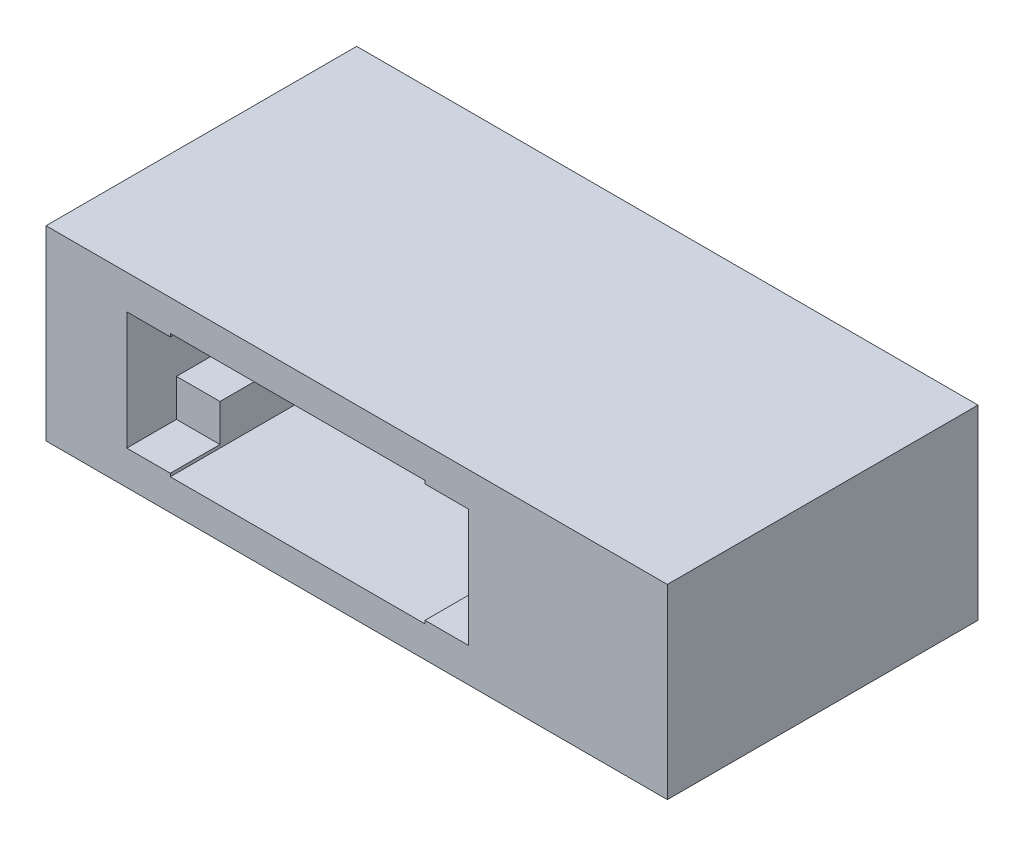
ISO-10303-21;
HEADER;
FILE_DESCRIPTION(('STEP AP214'),'2;1');
FILE_NAME('part.step','',(''),(''),'','','');
FILE_SCHEMA(('AUTOMOTIVE_DESIGN { 1 0 10303 214 1 1 1 1 }'));
ENDSEC;
DATA;
#1=APPLICATION_CONTEXT('core data for automotive mechanical design processes');
#2=APPLICATION_PROTOCOL_DEFINITION('international standard','automotive_design',2000,#1);
#3=PRODUCT_CONTEXT('',#1,'mechanical');
#4=PRODUCT('Part','Part','',(#3));
#5=PRODUCT_RELATED_PRODUCT_CATEGORY('part','',(#4));
#6=PRODUCT_DEFINITION_FORMATION('','',#4);
#7=PRODUCT_DEFINITION_CONTEXT('part definition',#1,'design');
#8=PRODUCT_DEFINITION('design','',#6,#7);
#9=PRODUCT_DEFINITION_SHAPE('','',#8);
#10=(LENGTH_UNIT() NAMED_UNIT(*) SI_UNIT(.MILLI.,.METRE.));
#11=(NAMED_UNIT(*) PLANE_ANGLE_UNIT() SI_UNIT($,.RADIAN.));
#12=(NAMED_UNIT(*) SI_UNIT($,.STERADIAN.) SOLID_ANGLE_UNIT());
#13=UNCERTAINTY_MEASURE_WITH_UNIT(LENGTH_MEASURE(1.E-05),#10,'distance_accuracy_value','');
#14=(GEOMETRIC_REPRESENTATION_CONTEXT(3) GLOBAL_UNCERTAINTY_ASSIGNED_CONTEXT((#13)) GLOBAL_UNIT_ASSIGNED_CONTEXT((#10,
#11,#12)) REPRESENTATION_CONTEXT('',''));
#15=CARTESIAN_POINT('',(0.,0.,0.));
#16=DIRECTION('',(0.,0.,1.));
#17=DIRECTION('',(1.,0.,0.));
#18=AXIS2_PLACEMENT_3D('',#15,#16,#17);
#19=CARTESIAN_POINT('',(0.,0.,13.));
#20=DIRECTION('',(0.,0.,-1.));
#21=DIRECTION('',(-1.,0.,0.));
#22=AXIS2_PLACEMENT_3D('',#19,#20,#21);
#23=PLANE('',#22);
#24=DIRECTION('',(1.,0.,0.));
#25=VECTOR('',#24,1.);
#26=CARTESIAN_POINT('',(-23.9699208264724,0.395348837209302,13.));
#27=LINE('',#26,#25);
#28=CARTESIAN_POINT('',(-16.9699208264724,0.395348837209302,13.));
#29=VERTEX_POINT('',#28);
#30=CARTESIAN_POINT('',(24.0300791735276,0.395348837209302,13.));
#31=VERTEX_POINT('',#30);
#32=EDGE_CURVE('E11',#29,#31,#27,.T.);
#33=ORIENTED_EDGE('',*,*,#32,.F.);
#34=DIRECTION('',(0.,-1.,0.));
#35=VECTOR('',#34,1.);
#36=CARTESIAN_POINT('',(-16.9699208264724,13.8953488372093,13.));
#37=LINE('',#36,#35);
#38=CARTESIAN_POINT('',(-16.9699208264724,-6.1046511627907,13.));
#39=VERTEX_POINT('',#38);
#40=EDGE_CURVE('E322',#29,#39,#37,.T.);
#41=ORIENTED_EDGE('',*,*,#40,.T.);
#42=DIRECTION('',(1.,0.,0.));
#43=VECTOR('',#42,1.);
#44=CARTESIAN_POINT('',(-16.9699208264724,-6.1046511627907,13.));
#45=LINE('',#44,#43);
#46=CARTESIAN_POINT('',(24.0300791735276,-6.1046511627907,13.));
#47=VERTEX_POINT('',#46);
#48=EDGE_CURVE('E314',#39,#47,#45,.T.);
#49=ORIENTED_EDGE('',*,*,#48,.T.);
#50=DIRECTION('',(0.,-1.,0.));
#51=VECTOR('',#50,1.);
#52=CARTESIAN_POINT('',(24.0300791735276,13.8953488372093,13.));
#53=LINE('',#52,#51);
#54=EDGE_CURVE('E317',#31,#47,#53,.T.);
#55=ORIENTED_EDGE('',*,*,#54,.F.);
#56=EDGE_LOOP('',(#33,#41,#49,#55));
#57=FACE_BOUND('',#56,.T.);
#58=ADVANCED_FACE('F38',(#57),#23,.F.);
#59=DIRECTION('',(-1.,0.,0.));
#60=VECTOR('',#59,1.);
#61=CARTESIAN_POINT('',(-23.9699208264724,7.3953488372093,13.));
#62=LINE('',#61,#60);
#63=CARTESIAN_POINT('',(24.0300791735276,7.3953488372093,13.));
#64=VERTEX_POINT('',#63);
#65=CARTESIAN_POINT('',(-16.9699208264724,7.3953488372093,13.));
#66=VERTEX_POINT('',#65);
#67=EDGE_CURVE('E219',#64,#66,#62,.T.);
#68=ORIENTED_EDGE('',*,*,#67,.F.);
#69=CARTESIAN_POINT('',(24.0300791735276,13.8953488372093,13.));
#70=VERTEX_POINT('',#69);
#71=EDGE_CURVE('E208',#70,#64,#53,.T.);
#72=ORIENTED_EDGE('',*,*,#71,.F.);
#73=DIRECTION('',(1.,0.,0.));
#74=VECTOR('',#73,1.);
#75=CARTESIAN_POINT('',(-16.9699208264724,13.8953488372093,13.));
#76=LINE('',#75,#74);
#77=CARTESIAN_POINT('',(-16.9699208264724,13.8953488372093,13.));
#78=VERTEX_POINT('',#77);
#79=EDGE_CURVE('E320',#78,#70,#76,.T.);
#80=ORIENTED_EDGE('',*,*,#79,.F.);
#81=EDGE_CURVE('E323',#78,#66,#37,.T.);
#82=ORIENTED_EDGE('',*,*,#81,.T.);
#83=EDGE_LOOP('',(#68,#72,#80,#82));
#84=FACE_BOUND('',#83,.T.);
#85=ADVANCED_FACE('F406',(#84),#23,.F.);
#86=CARTESIAN_POINT('',(-16.9699208264724,13.8953488372093,13.));
#87=DIRECTION('',(-1.,0.,0.));
#88=DIRECTION('',(0.,-1.,0.));
#89=AXIS2_PLACEMENT_3D('',#86,#87,#88);
#90=PLANE('',#89);
#91=ORIENTED_EDGE('',*,*,#40,.F.);
#92=DIRECTION('',(0.,0.,1.));
#93=VECTOR('',#92,1.);
#94=CARTESIAN_POINT('',(-16.9699208264724,0.395348837209302,13.));
#95=LINE('',#94,#93);
#96=CARTESIAN_POINT('',(-16.9699208264724,0.395348837209302,42.));
#97=VERTEX_POINT('',#96);
#98=EDGE_CURVE('E248',#29,#97,#95,.T.);
#99=ORIENTED_EDGE('',*,*,#98,.T.);
#100=DIRECTION('',(0.,1.,0.));
#101=VECTOR('',#100,1.);
#102=CARTESIAN_POINT('',(-16.9699208264724,13.3953488372093,42.));
#103=LINE('',#102,#101);
#104=CARTESIAN_POINT('',(-16.9699208264724,-5.6046511627907,42.));
#105=VERTEX_POINT('',#104);
#106=EDGE_CURVE('E286',#105,#97,#103,.T.);
#107=ORIENTED_EDGE('',*,*,#106,.F.);
#108=DIRECTION('',(0.,0.,1.));
#109=VECTOR('',#108,1.);
#110=CARTESIAN_POINT('',(-16.9699208264724,-5.6046511627907,42.));
#111=LINE('',#110,#109);
#112=CARTESIAN_POINT('',(-16.9699208264724,-5.6046511627907,50.));
#113=VERTEX_POINT('',#112);
#114=EDGE_CURVE('E274',#105,#113,#111,.T.);
#115=ORIENTED_EDGE('',*,*,#114,.T.);
#116=DIRECTION('',(0.,-1.,0.));
#117=VECTOR('',#116,1.);
#118=CARTESIAN_POINT('',(-16.9699208264724,13.8953488372093,50.));
#119=LINE('',#118,#117);
#120=CARTESIAN_POINT('',(-16.9699208264724,-6.1046511627907,50.));
#121=VERTEX_POINT('',#120);
#122=EDGE_CURVE('E336',#113,#121,#119,.T.);
#123=ORIENTED_EDGE('',*,*,#122,.T.);
#124=DIRECTION('',(0.,0.,1.));
#125=VECTOR('',#124,1.);
#126=CARTESIAN_POINT('',(-16.9699208264724,-6.1046511627907,13.));
#127=LINE('',#126,#125);
#128=EDGE_CURVE('E339',#39,#121,#127,.T.);
#129=ORIENTED_EDGE('',*,*,#128,.F.);
#130=EDGE_LOOP('',(#91,#99,#107,#115,#123,#129));
#131=FACE_BOUND('',#130,.T.);
#132=ADVANCED_FACE('F412',(#131),#90,.F.);
#133=CARTESIAN_POINT('',(0.,0.,42.));
#134=DIRECTION('',(0.,0.,-1.));
#135=DIRECTION('',(-1.,0.,0.));
#136=AXIS2_PLACEMENT_3D('',#133,#134,#135);
#137=PLANE('',#136);
#138=ORIENTED_EDGE('',*,*,#106,.T.);
#139=DIRECTION('',(1.,0.,0.));
#140=VECTOR('',#139,1.);
#141=CARTESIAN_POINT('',(-16.9699208264724,0.395348837209302,42.));
#142=LINE('',#141,#140);
#143=CARTESIAN_POINT('',(-23.9699208264724,0.395348837209302,42.));
#144=VERTEX_POINT('',#143);
#145=EDGE_CURVE('E245',#144,#97,#142,.T.);
#146=ORIENTED_EDGE('',*,*,#145,.F.);
#147=DIRECTION('',(0.,-1.,0.));
#148=VECTOR('',#147,1.);
#149=CARTESIAN_POINT('',(-23.9699208264724,13.3953488372093,42.));
#150=LINE('',#149,#148);
#151=CARTESIAN_POINT('',(-23.9699208264724,-5.6046511627907,42.));
#152=VERTEX_POINT('',#151);
#153=EDGE_CURVE('E293',#144,#152,#150,.T.);
#154=ORIENTED_EDGE('',*,*,#153,.T.);
#155=DIRECTION('',(1.,0.,0.));
#156=VECTOR('',#155,1.);
#157=CARTESIAN_POINT('',(-16.9699208264724,-5.6046511627907,42.));
#158=LINE('',#157,#156);
#159=EDGE_CURVE('E297',#152,#105,#158,.T.);
#160=ORIENTED_EDGE('',*,*,#159,.T.);
#161=EDGE_LOOP('',(#138,#146,#154,#160));
#162=FACE_BOUND('',#161,.T.);
#163=ADVANCED_FACE('F499',(#162),#137,.F.);
#164=CARTESIAN_POINT('',(-36.9699208264724,-11.1046511627907,50.));
#165=DIRECTION('',(0.,1.,0.));
#166=DIRECTION('',(0.,0.,1.));
#167=AXIS2_PLACEMENT_3D('',#164,#165,#166);
#168=PLANE('',#167);
#169=DIRECTION('',(1.,0.,0.));
#170=VECTOR('',#169,1.);
#171=CARTESIAN_POINT('',(-36.9699208264724,-11.1046511627907,0.));
#172=LINE('',#171,#170);
#173=CARTESIAN_POINT('',(-36.9699208264724,-11.1046511627907,0.));
#174=VERTEX_POINT('',#173);
#175=CARTESIAN_POINT('',(63.0300791735277,-11.1046511627907,0.));
#176=VERTEX_POINT('',#175);
#177=EDGE_CURVE('E342',#174,#176,#172,.T.);
#178=ORIENTED_EDGE('',*,*,#177,.T.);
#179=DIRECTION('',(0.,0.,-1.));
#180=VECTOR('',#179,1.);
#181=CARTESIAN_POINT('',(63.0300791735277,-11.1046511627907,50.));
#182=LINE('',#181,#180);
#183=CARTESIAN_POINT('',(63.0300791735277,-11.1046511627907,50.));
#184=VERTEX_POINT('',#183);
#185=EDGE_CURVE('E42',#184,#176,#182,.T.);
#186=ORIENTED_EDGE('',*,*,#185,.F.);
#187=DIRECTION('',(1.,0.,0.));
#188=VECTOR('',#187,1.);
#189=CARTESIAN_POINT('',(-36.9699208264724,-11.1046511627907,50.));
#190=LINE('',#189,#188);
#191=CARTESIAN_POINT('',(-36.9699208264724,-11.1046511627907,50.));
#192=VERTEX_POINT('',#191);
#193=EDGE_CURVE('E349',#192,#184,#190,.T.);
#194=ORIENTED_EDGE('',*,*,#193,.F.);
#195=DIRECTION('',(0.,0.,-1.));
#196=VECTOR('',#195,1.);
#197=CARTESIAN_POINT('',(-36.9699208264724,-11.1046511627907,50.));
#198=LINE('',#197,#196);
#199=EDGE_CURVE('E360',#192,#174,#198,.T.);
#200=ORIENTED_EDGE('',*,*,#199,.T.);
#201=EDGE_LOOP('',(#178,#186,#194,#200));
#202=FACE_BOUND('',#201,.T.);
#203=ADVANCED_FACE('F40',(#202),#168,.F.);
#204=CARTESIAN_POINT('',(63.0300791735276,18.8953488372093,50.));
#205=DIRECTION('',(1.,0.,0.));
#206=DIRECTION('',(0.,1.,0.));
#207=AXIS2_PLACEMENT_3D('',#204,#205,#206);
#208=PLANE('',#207);
#209=DIRECTION('',(0.,-1.,0.));
#210=VECTOR('',#209,1.);
#211=CARTESIAN_POINT('',(63.0300791735276,18.8953488372093,0.));
#212=LINE('',#211,#210);
#213=CARTESIAN_POINT('',(63.0300791735276,18.8953488372093,0.));
#214=VERTEX_POINT('',#213);
#215=EDGE_CURVE('E363',#214,#176,#212,.T.);
#216=ORIENTED_EDGE('',*,*,#215,.F.);
#217=DIRECTION('',(0.,0.,-1.));
#218=VECTOR('',#217,1.);
#219=CARTESIAN_POINT('',(63.0300791735276,18.8953488372093,50.));
#220=LINE('',#219,#218);
#221=CARTESIAN_POINT('',(63.0300791735276,18.8953488372093,50.));
#222=VERTEX_POINT('',#221);
#223=EDGE_CURVE('E373',#222,#214,#220,.T.);
#224=ORIENTED_EDGE('',*,*,#223,.F.);
#225=DIRECTION('',(0.,-1.,0.));
#226=VECTOR('',#225,1.);
#227=CARTESIAN_POINT('',(63.0300791735276,18.8953488372093,50.));
#228=LINE('',#227,#226);
#229=EDGE_CURVE('E351',#222,#184,#228,.T.);
#230=ORIENTED_EDGE('',*,*,#229,.T.);
#231=ORIENTED_EDGE('',*,*,#185,.T.);
#232=EDGE_LOOP('',(#216,#224,#230,#231));
#233=FACE_BOUND('',#232,.T.);
#234=ADVANCED_FACE('F379',(#233),#208,.T.);
#235=CARTESIAN_POINT('',(-36.9699208264724,18.8953488372093,50.));
#236=DIRECTION('',(0.,1.,0.));
#237=DIRECTION('',(0.,0.,1.));
#238=AXIS2_PLACEMENT_3D('',#235,#236,#237);
#239=PLANE('',#238);
#240=DIRECTION('',(1.,0.,0.));
#241=VECTOR('',#240,1.);
#242=CARTESIAN_POINT('',(-36.9699208264724,18.8953488372093,0.));
#243=LINE('',#242,#241);
#244=CARTESIAN_POINT('',(-36.9699208264724,18.8953488372093,0.));
#245=VERTEX_POINT('',#244);
#246=EDGE_CURVE('E366',#245,#214,#243,.T.);
#247=ORIENTED_EDGE('',*,*,#246,.F.);
#248=DIRECTION('',(0.,0.,-1.));
#249=VECTOR('',#248,1.);
#250=CARTESIAN_POINT('',(-36.9699208264724,18.8953488372093,50.));
#251=LINE('',#250,#249);
#252=CARTESIAN_POINT('',(-36.9699208264724,18.8953488372093,50.));
#253=VERTEX_POINT('',#252);
#254=EDGE_CURVE('E372',#253,#245,#251,.T.);
#255=ORIENTED_EDGE('',*,*,#254,.F.);
#256=DIRECTION('',(1.,0.,0.));
#257=VECTOR('',#256,1.);
#258=CARTESIAN_POINT('',(-36.9699208264724,18.8953488372093,50.));
#259=LINE('',#258,#257);
#260=EDGE_CURVE('E355',#253,#222,#259,.T.);
#261=ORIENTED_EDGE('',*,*,#260,.T.);
#262=ORIENTED_EDGE('',*,*,#223,.T.);
#263=EDGE_LOOP('',(#247,#255,#261,#262));
#264=FACE_BOUND('',#263,.T.);
#265=ADVANCED_FACE('F386',(#264),#239,.T.);
#266=CARTESIAN_POINT('',(-36.9699208264724,18.8953488372093,50.));
#267=DIRECTION('',(1.,0.,0.));
#268=DIRECTION('',(0.,0.,-1.));
#269=AXIS2_PLACEMENT_3D('',#266,#267,#268);
#270=PLANE('',#269);
#271=DIRECTION('',(0.,-1.,0.));
#272=VECTOR('',#271,1.);
#273=CARTESIAN_POINT('',(-36.9699208264724,18.8953488372093,0.));
#274=LINE('',#273,#272);
#275=EDGE_CURVE('E352',#245,#174,#274,.T.);
#276=ORIENTED_EDGE('',*,*,#275,.T.);
#277=ORIENTED_EDGE('',*,*,#199,.F.);
#278=DIRECTION('',(0.,-1.,0.));
#279=VECTOR('',#278,1.);
#280=CARTESIAN_POINT('',(-36.9699208264724,18.8953488372093,50.));
#281=LINE('',#280,#279);
#282=EDGE_CURVE('E358',#253,#192,#281,.T.);
#283=ORIENTED_EDGE('',*,*,#282,.F.);
#284=ORIENTED_EDGE('',*,*,#254,.T.);
#285=EDGE_LOOP('',(#276,#277,#283,#284));
#286=FACE_BOUND('',#285,.T.);
#287=ADVANCED_FACE('F390',(#286),#270,.F.);
#288=CARTESIAN_POINT('',(0.,0.,50.));
#289=DIRECTION('',(0.,0.,-1.));
#290=DIRECTION('',(-1.,0.,0.));
#291=AXIS2_PLACEMENT_3D('',#288,#289,#290);
#292=PLANE('',#291);
#293=DIRECTION('',(0.,-1.,0.));
#294=VECTOR('',#293,1.);
#295=CARTESIAN_POINT('',(24.0300791735276,13.8953488372093,50.));
#296=LINE('',#295,#294);
#297=CARTESIAN_POINT('',(24.0300791735276,13.8953488372093,50.));
#298=VERTEX_POINT('',#297);
#299=CARTESIAN_POINT('',(24.0300791735276,13.3953488372093,50.));
#300=VERTEX_POINT('',#299);
#301=EDGE_CURVE('E330',#298,#300,#296,.T.);
#302=ORIENTED_EDGE('',*,*,#301,.T.);
#303=DIRECTION('',(-1.,0.,0.));
#304=VECTOR('',#303,1.);
#305=CARTESIAN_POINT('',(24.0300791735276,13.3953488372093,50.));
#306=LINE('',#305,#304);
#307=CARTESIAN_POINT('',(31.0300791735276,13.3953488372093,50.));
#308=VERTEX_POINT('',#307);
#309=EDGE_CURVE('E261',#308,#300,#306,.T.);
#310=ORIENTED_EDGE('',*,*,#309,.F.);
#311=DIRECTION('',(0.,1.,0.));
#312=VECTOR('',#311,1.);
#313=CARTESIAN_POINT('',(31.0300791735276,13.3953488372093,50.));
#314=LINE('',#313,#312);
#315=CARTESIAN_POINT('',(31.0300791735276,-5.6046511627907,50.));
#316=VERTEX_POINT('',#315);
#317=EDGE_CURVE('E273',#316,#308,#314,.T.);
#318=ORIENTED_EDGE('',*,*,#317,.F.);
#319=DIRECTION('',(1.,0.,0.));
#320=VECTOR('',#319,1.);
#321=CARTESIAN_POINT('',(24.0300791735276,-5.6046511627907,50.));
#322=LINE('',#321,#320);
#323=CARTESIAN_POINT('',(24.0300791735276,-5.6046511627907,50.));
#324=VERTEX_POINT('',#323);
#325=EDGE_CURVE('E270',#324,#316,#322,.T.);
#326=ORIENTED_EDGE('',*,*,#325,.F.);
#327=CARTESIAN_POINT('',(24.0300791735276,-6.1046511627907,50.));
#328=VERTEX_POINT('',#327);
#329=EDGE_CURVE('E329',#324,#328,#296,.T.);
#330=ORIENTED_EDGE('',*,*,#329,.T.);
#331=DIRECTION('',(1.,0.,0.));
#332=VECTOR('',#331,1.);
#333=CARTESIAN_POINT('',(-16.9699208264724,-6.1046511627907,50.));
#334=LINE('',#333,#332);
#335=EDGE_CURVE('E280',#121,#328,#334,.T.);
#336=ORIENTED_EDGE('',*,*,#335,.F.);
#337=ORIENTED_EDGE('',*,*,#122,.F.);
#338=DIRECTION('',(1.,0.,0.));
#339=VECTOR('',#338,1.);
#340=CARTESIAN_POINT('',(-16.9699208264724,-5.6046511627907,50.));
#341=LINE('',#340,#339);
#342=CARTESIAN_POINT('',(-23.9699208264724,-5.6046511627907,50.));
#343=VERTEX_POINT('',#342);
#344=EDGE_CURVE('E305',#343,#113,#341,.T.);
#345=ORIENTED_EDGE('',*,*,#344,.F.);
#346=DIRECTION('',(0.,-1.,0.));
#347=VECTOR('',#346,1.);
#348=CARTESIAN_POINT('',(-23.9699208264724,13.3953488372093,50.));
#349=LINE('',#348,#347);
#350=CARTESIAN_POINT('',(-23.9699208264724,13.3953488372093,50.));
#351=VERTEX_POINT('',#350);
#352=EDGE_CURVE('E302',#351,#343,#349,.T.);
#353=ORIENTED_EDGE('',*,*,#352,.F.);
#354=DIRECTION('',(-1.,0.,0.));
#355=VECTOR('',#354,1.);
#356=CARTESIAN_POINT('',(-16.9699208264724,13.3953488372093,50.));
#357=LINE('',#356,#355);
#358=CARTESIAN_POINT('',(-16.9699208264724,13.3953488372093,50.));
#359=VERTEX_POINT('',#358);
#360=EDGE_CURVE('E251',#359,#351,#357,.T.);
#361=ORIENTED_EDGE('',*,*,#360,.F.);
#362=CARTESIAN_POINT('',(-16.9699208264724,13.8953488372093,50.));
#363=VERTEX_POINT('',#362);
#364=EDGE_CURVE('E318',#363,#359,#119,.T.);
#365=ORIENTED_EDGE('',*,*,#364,.F.);
#366=DIRECTION('',(1.,0.,0.));
#367=VECTOR('',#366,1.);
#368=CARTESIAN_POINT('',(-16.9699208264724,13.8953488372093,50.));
#369=LINE('',#368,#367);
#370=EDGE_CURVE('E333',#363,#298,#369,.T.);
#371=ORIENTED_EDGE('',*,*,#370,.T.);
#372=EDGE_LOOP('',(#302,#310,#318,#326,#330,#336,#337,#345,#353,#361,#365,#371));
#373=FACE_BOUND('',#372,.T.);
#374=ORIENTED_EDGE('',*,*,#193,.T.);
#375=ORIENTED_EDGE('',*,*,#229,.F.);
#376=ORIENTED_EDGE('',*,*,#260,.F.);
#377=ORIENTED_EDGE('',*,*,#282,.T.);
#378=EDGE_LOOP('',(#374,#375,#376,#377));
#379=FACE_BOUND('',#378,.T.);
#380=ADVANCED_FACE('F392',(#373,#379),#292,.F.);
#381=CARTESIAN_POINT('',(0.,0.,0.));
#382=DIRECTION('',(0.,0.,-1.));
#383=DIRECTION('',(-1.,0.,0.));
#384=AXIS2_PLACEMENT_3D('',#381,#382,#383);
#385=PLANE('',#384);
#386=CARTESIAN_POINT('',(-7.96992082647236,3.8953488372093,0.));
#387=DIRECTION('',(0.,0.,-1.));
#388=DIRECTION('',(-1.,0.,0.));
#389=AXIS2_PLACEMENT_3D('',#386,#387,#388);
#390=CIRCLE('',#389,2.5);
#391=CARTESIAN_POINT('',(-10.4699208264724,3.8953488372093,0.));
#392=VERTEX_POINT('',#391);
#393=EDGE_CURVE('E714',#392,#392,#390,.T.);
#394=ORIENTED_EDGE('',*,*,#393,.F.);
#395=EDGE_LOOP('',(#394));
#396=FACE_BOUND('',#395,.T.);
#397=DIRECTION('',(0.,1.,0.));
#398=VECTOR('',#397,1.);
#399=CARTESIAN_POINT('',(24.0300791735276,7.3953488372093,0.));
#400=LINE('',#399,#398);
#401=CARTESIAN_POINT('',(24.0300791735276,0.395348837209302,0.));
#402=VERTEX_POINT('',#401);
#403=CARTESIAN_POINT('',(24.0300791735276,7.3953488372093,0.));
#404=VERTEX_POINT('',#403);
#405=EDGE_CURVE('E204',#402,#404,#400,.T.);
#406=ORIENTED_EDGE('',*,*,#405,.T.);
#407=DIRECTION('',(-1.,0.,0.));
#408=VECTOR('',#407,1.);
#409=CARTESIAN_POINT('',(24.0300791735276,7.3953488372093,0.));
#410=LINE('',#409,#408);
#411=CARTESIAN_POINT('',(19.0300791735276,7.3953488372093,0.));
#412=VERTEX_POINT('',#411);
#413=EDGE_CURVE('E214',#404,#412,#410,.T.);
#414=ORIENTED_EDGE('',*,*,#413,.T.);
#415=DIRECTION('',(0.,-1.,0.));
#416=VECTOR('',#415,1.);
#417=CARTESIAN_POINT('',(19.0300791735276,7.3953488372093,0.));
#418=LINE('',#417,#416);
#419=CARTESIAN_POINT('',(19.0300791735276,0.395348837209302,0.));
#420=VERTEX_POINT('',#419);
#421=EDGE_CURVE('E228',#412,#420,#418,.T.);
#422=ORIENTED_EDGE('',*,*,#421,.T.);
#423=DIRECTION('',(1.,0.,0.));
#424=VECTOR('',#423,1.);
#425=CARTESIAN_POINT('',(24.0300791735276,0.395348837209302,0.));
#426=LINE('',#425,#424);
#427=EDGE_CURVE('E224',#420,#402,#426,.T.);
#428=ORIENTED_EDGE('',*,*,#427,.T.);
#429=EDGE_LOOP('',(#406,#414,#422,#428));
#430=FACE_BOUND('',#429,.T.);
#431=ORIENTED_EDGE('',*,*,#177,.F.);
#432=ORIENTED_EDGE('',*,*,#275,.F.);
#433=ORIENTED_EDGE('',*,*,#246,.T.);
#434=ORIENTED_EDGE('',*,*,#215,.T.);
#435=EDGE_LOOP('',(#431,#432,#433,#434));
#436=FACE_BOUND('',#435,.T.);
#437=ADVANCED_FACE('F222',(#396,#430,#436),#385,.T.);
#438=CARTESIAN_POINT('',(-16.9699208264724,-6.1046511627907,13.));
#439=DIRECTION('',(0.,-1.,0.));
#440=DIRECTION('',(1.,0.,0.));
#441=AXIS2_PLACEMENT_3D('',#438,#439,#440);
#442=PLANE('',#441);
#443=ORIENTED_EDGE('',*,*,#335,.T.);
#444=DIRECTION('',(0.,0.,1.));
#445=VECTOR('',#444,1.);
#446=CARTESIAN_POINT('',(24.0300791735276,-6.1046511627907,13.));
#447=LINE('',#446,#445);
#448=EDGE_CURVE('E326',#47,#328,#447,.T.);
#449=ORIENTED_EDGE('',*,*,#448,.F.);
#450=ORIENTED_EDGE('',*,*,#48,.F.);
#451=ORIENTED_EDGE('',*,*,#128,.T.);
#452=EDGE_LOOP('',(#443,#449,#450,#451));
#453=FACE_BOUND('',#452,.T.);
#454=ADVANCED_FACE('F400',(#453),#442,.F.);
#455=CARTESIAN_POINT('',(-16.9699208264724,7.3953488372093,42.));
#456=VERTEX_POINT('',#455);
#457=CARTESIAN_POINT('',(-16.9699208264724,13.3953488372093,42.));
#458=VERTEX_POINT('',#457);
#459=EDGE_CURVE('E290',#456,#458,#103,.T.);
#460=ORIENTED_EDGE('',*,*,#459,.F.);
#461=DIRECTION('',(0.,0.,1.));
#462=VECTOR('',#461,1.);
#463=CARTESIAN_POINT('',(-16.9699208264724,7.3953488372093,13.));
#464=LINE('',#463,#462);
#465=EDGE_CURVE('E247',#66,#456,#464,.T.);
#466=ORIENTED_EDGE('',*,*,#465,.F.);
#467=ORIENTED_EDGE('',*,*,#81,.F.);
#468=DIRECTION('',(0.,0.,1.));
#469=VECTOR('',#468,1.);
#470=CARTESIAN_POINT('',(-16.9699208264724,13.8953488372093,13.));
#471=LINE('',#470,#469);
#472=EDGE_CURVE('E343',#78,#363,#471,.T.);
#473=ORIENTED_EDGE('',*,*,#472,.T.);
#474=ORIENTED_EDGE('',*,*,#364,.T.);
#475=DIRECTION('',(0.,0.,1.));
#476=VECTOR('',#475,1.);
#477=CARTESIAN_POINT('',(-16.9699208264724,13.3953488372093,42.));
#478=LINE('',#477,#476);
#479=EDGE_CURVE('E299',#458,#359,#478,.T.);
#480=ORIENTED_EDGE('',*,*,#479,.F.);
#481=EDGE_LOOP('',(#460,#466,#467,#473,#474,#480));
#482=FACE_BOUND('',#481,.T.);
#483=ADVANCED_FACE('F418',(#482),#90,.F.);
#484=CARTESIAN_POINT('',(-16.9699208264724,13.8953488372093,13.));
#485=DIRECTION('',(0.,-1.,0.));
#486=DIRECTION('',(1.,0.,0.));
#487=AXIS2_PLACEMENT_3D('',#484,#485,#486);
#488=PLANE('',#487);
#489=ORIENTED_EDGE('',*,*,#370,.F.);
#490=ORIENTED_EDGE('',*,*,#472,.F.);
#491=ORIENTED_EDGE('',*,*,#79,.T.);
#492=DIRECTION('',(0.,0.,1.));
#493=VECTOR('',#492,1.);
#494=CARTESIAN_POINT('',(24.0300791735276,13.8953488372093,13.));
#495=LINE('',#494,#493);
#496=EDGE_CURVE('E345',#70,#298,#495,.T.);
#497=ORIENTED_EDGE('',*,*,#496,.T.);
#498=EDGE_LOOP('',(#489,#490,#491,#497));
#499=FACE_BOUND('',#498,.T.);
#500=ADVANCED_FACE('F421',(#499),#488,.T.);
#501=CARTESIAN_POINT('',(24.0300791735276,13.8953488372093,13.));
#502=DIRECTION('',(-1.,0.,0.));
#503=DIRECTION('',(0.,0.,1.));
#504=AXIS2_PLACEMENT_3D('',#501,#502,#503);
#505=PLANE('',#504);
#506=DIRECTION('',(0.,0.,1.));
#507=VECTOR('',#506,1.);
#508=CARTESIAN_POINT('',(24.0300791735276,13.3953488372093,42.));
#509=LINE('',#508,#507);
#510=CARTESIAN_POINT('',(24.0300791735276,13.3953488372093,42.));
#511=VERTEX_POINT('',#510);
#512=EDGE_CURVE('E278',#511,#300,#509,.T.);
#513=ORIENTED_EDGE('',*,*,#512,.T.);
#514=ORIENTED_EDGE('',*,*,#301,.F.);
#515=ORIENTED_EDGE('',*,*,#496,.F.);
#516=ORIENTED_EDGE('',*,*,#71,.T.);
#517=DIRECTION('',(0.,0.,1.));
#518=VECTOR('',#517,1.);
#519=CARTESIAN_POINT('',(24.0300791735276,7.3953488372093,8.));
#520=LINE('',#519,#518);
#521=EDGE_CURVE('E199',#404,#64,#520,.T.);
#522=ORIENTED_EDGE('',*,*,#521,.F.);
#523=ORIENTED_EDGE('',*,*,#405,.F.);
#524=DIRECTION('',(0.,0.,1.));
#525=VECTOR('',#524,1.);
#526=CARTESIAN_POINT('',(24.0300791735276,0.395348837209302,8.));
#527=LINE('',#526,#525);
#528=EDGE_CURVE('E211',#402,#31,#527,.T.);
#529=ORIENTED_EDGE('',*,*,#528,.T.);
#530=ORIENTED_EDGE('',*,*,#54,.T.);
#531=ORIENTED_EDGE('',*,*,#448,.T.);
#532=ORIENTED_EDGE('',*,*,#329,.F.);
#533=DIRECTION('',(0.,0.,1.));
#534=VECTOR('',#533,1.);
#535=CARTESIAN_POINT('',(24.0300791735276,-5.6046511627907,42.));
#536=LINE('',#535,#534);
#537=CARTESIAN_POINT('',(24.0300791735276,-5.6046511627907,42.));
#538=VERTEX_POINT('',#537);
#539=EDGE_CURVE('E269',#538,#324,#536,.T.);
#540=ORIENTED_EDGE('',*,*,#539,.F.);
#541=DIRECTION('',(0.,-1.,0.));
#542=VECTOR('',#541,1.);
#543=CARTESIAN_POINT('',(24.0300791735276,13.3953488372093,42.));
#544=LINE('',#543,#542);
#545=EDGE_CURVE('E257',#511,#538,#544,.T.);
#546=ORIENTED_EDGE('',*,*,#545,.F.);
#547=EDGE_LOOP('',(#513,#514,#515,#516,#522,#523,#529,#530,#531,#532,#540,#546));
#548=FACE_BOUND('',#547,.T.);
#549=ADVANCED_FACE('F201',(#548),#505,.T.);
#550=CARTESIAN_POINT('',(24.0300791735276,13.3953488372093,42.));
#551=DIRECTION('',(0.,1.,0.));
#552=DIRECTION('',(-1.,0.,0.));
#553=AXIS2_PLACEMENT_3D('',#550,#551,#552);
#554=PLANE('',#553);
#555=ORIENTED_EDGE('',*,*,#309,.T.);
#556=ORIENTED_EDGE('',*,*,#512,.F.);
#557=DIRECTION('',(-1.,0.,0.));
#558=VECTOR('',#557,1.);
#559=CARTESIAN_POINT('',(24.0300791735276,13.3953488372093,42.));
#560=LINE('',#559,#558);
#561=CARTESIAN_POINT('',(31.0300791735276,13.3953488372093,42.));
#562=VERTEX_POINT('',#561);
#563=EDGE_CURVE('E267',#562,#511,#560,.T.);
#564=ORIENTED_EDGE('',*,*,#563,.F.);
#565=DIRECTION('',(0.,0.,1.));
#566=VECTOR('',#565,1.);
#567=CARTESIAN_POINT('',(31.0300791735276,13.3953488372093,42.));
#568=LINE('',#567,#566);
#569=EDGE_CURVE('E281',#562,#308,#568,.T.);
#570=ORIENTED_EDGE('',*,*,#569,.T.);
#571=EDGE_LOOP('',(#555,#556,#564,#570));
#572=FACE_BOUND('',#571,.T.);
#573=ADVANCED_FACE('F427',(#572),#554,.F.);
#574=CARTESIAN_POINT('',(31.0300791735276,13.3953488372093,42.));
#575=DIRECTION('',(1.,0.,0.));
#576=DIRECTION('',(0.,1.,0.));
#577=AXIS2_PLACEMENT_3D('',#574,#575,#576);
#578=PLANE('',#577);
#579=ORIENTED_EDGE('',*,*,#317,.T.);
#580=ORIENTED_EDGE('',*,*,#569,.F.);
#581=DIRECTION('',(0.,1.,0.));
#582=VECTOR('',#581,1.);
#583=CARTESIAN_POINT('',(31.0300791735276,13.3953488372093,42.));
#584=LINE('',#583,#582);
#585=CARTESIAN_POINT('',(31.0300791735276,-5.6046511627907,42.));
#586=VERTEX_POINT('',#585);
#587=EDGE_CURVE('E264',#586,#562,#584,.T.);
#588=ORIENTED_EDGE('',*,*,#587,.F.);
#589=DIRECTION('',(0.,0.,1.));
#590=VECTOR('',#589,1.);
#591=CARTESIAN_POINT('',(31.0300791735276,-5.6046511627907,42.));
#592=LINE('',#591,#590);
#593=EDGE_CURVE('E283',#586,#316,#592,.T.);
#594=ORIENTED_EDGE('',*,*,#593,.T.);
#595=EDGE_LOOP('',(#579,#580,#588,#594));
#596=FACE_BOUND('',#595,.T.);
#597=ADVANCED_FACE('F474',(#596),#578,.F.);
#598=CARTESIAN_POINT('',(24.0300791735276,-5.6046511627907,42.));
#599=DIRECTION('',(0.,-1.,0.));
#600=DIRECTION('',(1.,0.,0.));
#601=AXIS2_PLACEMENT_3D('',#598,#599,#600);
#602=PLANE('',#601);
#603=ORIENTED_EDGE('',*,*,#325,.T.);
#604=ORIENTED_EDGE('',*,*,#593,.F.);
#605=DIRECTION('',(1.,0.,0.));
#606=VECTOR('',#605,1.);
#607=CARTESIAN_POINT('',(24.0300791735276,-5.6046511627907,42.));
#608=LINE('',#607,#606);
#609=EDGE_CURVE('E260',#538,#586,#608,.T.);
#610=ORIENTED_EDGE('',*,*,#609,.F.);
#611=ORIENTED_EDGE('',*,*,#539,.T.);
#612=EDGE_LOOP('',(#603,#604,#610,#611));
#613=FACE_BOUND('',#612,.T.);
#614=ADVANCED_FACE('F477',(#613),#602,.F.);
#615=CARTESIAN_POINT('',(0.,0.,42.));
#616=DIRECTION('',(0.,0.,1.));
#617=DIRECTION('',(1.,0.,0.));
#618=AXIS2_PLACEMENT_3D('',#615,#616,#617);
#619=PLANE('',#618);
#620=ORIENTED_EDGE('',*,*,#545,.T.);
#621=ORIENTED_EDGE('',*,*,#609,.T.);
#622=ORIENTED_EDGE('',*,*,#587,.T.);
#623=ORIENTED_EDGE('',*,*,#563,.T.);
#624=EDGE_LOOP('',(#620,#621,#622,#623));
#625=FACE_BOUND('',#624,.T.);
#626=ADVANCED_FACE('F479',(#625),#619,.T.);
#627=CARTESIAN_POINT('',(-16.9699208264724,-5.6046511627907,42.));
#628=DIRECTION('',(0.,-1.,0.));
#629=DIRECTION('',(1.,0.,0.));
#630=AXIS2_PLACEMENT_3D('',#627,#628,#629);
#631=PLANE('',#630);
#632=ORIENTED_EDGE('',*,*,#344,.T.);
#633=ORIENTED_EDGE('',*,*,#114,.F.);
#634=ORIENTED_EDGE('',*,*,#159,.F.);
#635=DIRECTION('',(0.,0.,1.));
#636=VECTOR('',#635,1.);
#637=CARTESIAN_POINT('',(-23.9699208264724,-5.6046511627907,42.));
#638=LINE('',#637,#636);
#639=EDGE_CURVE('E309',#152,#343,#638,.T.);
#640=ORIENTED_EDGE('',*,*,#639,.T.);
#641=EDGE_LOOP('',(#632,#633,#634,#640));
#642=FACE_BOUND('',#641,.T.);
#643=ADVANCED_FACE('F449',(#642),#631,.F.);
#644=CARTESIAN_POINT('',(-23.9699208264724,13.3953488372093,42.));
#645=DIRECTION('',(-1.,0.,0.));
#646=DIRECTION('',(0.,-1.,0.));
#647=AXIS2_PLACEMENT_3D('',#644,#645,#646);
#648=PLANE('',#647);
#649=ORIENTED_EDGE('',*,*,#352,.T.);
#650=ORIENTED_EDGE('',*,*,#639,.F.);
#651=ORIENTED_EDGE('',*,*,#153,.F.);
#652=DIRECTION('',(0.,0.,1.));
#653=VECTOR('',#652,1.);
#654=CARTESIAN_POINT('',(-23.9699208264724,0.395348837209302,13.));
#655=LINE('',#654,#653);
#656=CARTESIAN_POINT('',(-23.9699208264724,0.395348837209302,8.));
#657=VERTEX_POINT('',#656);
#658=EDGE_CURVE('E252',#657,#144,#655,.T.);
#659=ORIENTED_EDGE('',*,*,#658,.F.);
#660=DIRECTION('',(0.,-1.,0.));
#661=VECTOR('',#660,1.);
#662=CARTESIAN_POINT('',(-23.9699208264724,7.3953488372093,8.));
#663=LINE('',#662,#661);
#664=CARTESIAN_POINT('',(-23.9699208264724,7.3953488372093,8.));
#665=VERTEX_POINT('',#664);
#666=EDGE_CURVE('E234',#665,#657,#663,.T.);
#667=ORIENTED_EDGE('',*,*,#666,.F.);
#668=DIRECTION('',(0.,0.,1.));
#669=VECTOR('',#668,1.);
#670=CARTESIAN_POINT('',(-23.9699208264724,7.3953488372093,13.));
#671=LINE('',#670,#669);
#672=CARTESIAN_POINT('',(-23.9699208264724,7.3953488372093,42.));
#673=VERTEX_POINT('',#672);
#674=EDGE_CURVE('E254',#665,#673,#671,.T.);
#675=ORIENTED_EDGE('',*,*,#674,.T.);
#676=CARTESIAN_POINT('',(-23.9699208264724,13.3953488372093,42.));
#677=VERTEX_POINT('',#676);
#678=EDGE_CURVE('E294',#677,#673,#150,.T.);
#679=ORIENTED_EDGE('',*,*,#678,.F.);
#680=DIRECTION('',(0.,0.,1.));
#681=VECTOR('',#680,1.);
#682=CARTESIAN_POINT('',(-23.9699208264724,13.3953488372093,42.));
#683=LINE('',#682,#681);
#684=EDGE_CURVE('E311',#677,#351,#683,.T.);
#685=ORIENTED_EDGE('',*,*,#684,.T.);
#686=EDGE_LOOP('',(#649,#650,#651,#659,#667,#675,#679,#685));
#687=FACE_BOUND('',#686,.T.);
#688=ADVANCED_FACE('F454',(#687),#648,.F.);
#689=CARTESIAN_POINT('',(-16.9699208264724,13.3953488372093,42.));
#690=DIRECTION('',(0.,1.,0.));
#691=DIRECTION('',(0.,0.,1.));
#692=AXIS2_PLACEMENT_3D('',#689,#690,#691);
#693=PLANE('',#692);
#694=ORIENTED_EDGE('',*,*,#360,.T.);
#695=ORIENTED_EDGE('',*,*,#684,.F.);
#696=DIRECTION('',(-1.,0.,0.));
#697=VECTOR('',#696,1.);
#698=CARTESIAN_POINT('',(-16.9699208264724,13.3953488372093,42.));
#699=LINE('',#698,#697);
#700=EDGE_CURVE('E289',#458,#677,#699,.T.);
#701=ORIENTED_EDGE('',*,*,#700,.F.);
#702=ORIENTED_EDGE('',*,*,#479,.T.);
#703=EDGE_LOOP('',(#694,#695,#701,#702));
#704=FACE_BOUND('',#703,.T.);
#705=ADVANCED_FACE('F416',(#704),#693,.F.);
#706=ORIENTED_EDGE('',*,*,#678,.T.);
#707=DIRECTION('',(-1.,0.,0.));
#708=VECTOR('',#707,1.);
#709=CARTESIAN_POINT('',(-16.9699208264724,7.3953488372093,42.));
#710=LINE('',#709,#708);
#711=EDGE_CURVE('E210',#456,#673,#710,.T.);
#712=ORIENTED_EDGE('',*,*,#711,.F.);
#713=ORIENTED_EDGE('',*,*,#459,.T.);
#714=ORIENTED_EDGE('',*,*,#700,.T.);
#715=EDGE_LOOP('',(#706,#712,#713,#714));
#716=FACE_BOUND('',#715,.T.);
#717=ADVANCED_FACE('F495',(#716),#137,.F.);
#718=CARTESIAN_POINT('',(-16.9699208264724,0.395348837209302,13.));
#719=DIRECTION('',(0.,-1.,0.));
#720=DIRECTION('',(1.,0.,0.));
#721=AXIS2_PLACEMENT_3D('',#718,#719,#720);
#722=PLANE('',#721);
#723=ORIENTED_EDGE('',*,*,#145,.T.);
#724=ORIENTED_EDGE('',*,*,#98,.F.);
#725=ORIENTED_EDGE('',*,*,#32,.T.);
#726=ORIENTED_EDGE('',*,*,#528,.F.);
#727=ORIENTED_EDGE('',*,*,#427,.F.);
#728=DIRECTION('',(0.,0.,1.));
#729=VECTOR('',#728,1.);
#730=CARTESIAN_POINT('',(19.0300791735276,0.395348837209302,-0.000999999999999265));
#731=LINE('',#730,#729);
#732=CARTESIAN_POINT('',(19.0300791735276,0.395348837209302,8.));
#733=VERTEX_POINT('',#732);
#734=EDGE_CURVE('E220',#420,#733,#731,.T.);
#735=ORIENTED_EDGE('',*,*,#734,.T.);
#736=DIRECTION('',(1.,0.,0.));
#737=VECTOR('',#736,1.);
#738=CARTESIAN_POINT('',(-23.9699208264724,0.395348837209302,8.));
#739=LINE('',#738,#737);
#740=EDGE_CURVE('E237',#657,#733,#739,.T.);
#741=ORIENTED_EDGE('',*,*,#740,.F.);
#742=ORIENTED_EDGE('',*,*,#658,.T.);
#743=EDGE_LOOP('',(#723,#724,#725,#726,#727,#735,#741,#742));
#744=FACE_BOUND('',#743,.T.);
#745=ADVANCED_FACE('F497',(#744),#722,.F.);
#746=CARTESIAN_POINT('',(-16.9699208264724,7.3953488372093,13.));
#747=DIRECTION('',(0.,1.,0.));
#748=DIRECTION('',(-1.,0.,0.));
#749=AXIS2_PLACEMENT_3D('',#746,#747,#748);
#750=PLANE('',#749);
#751=ORIENTED_EDGE('',*,*,#711,.T.);
#752=ORIENTED_EDGE('',*,*,#674,.F.);
#753=DIRECTION('',(-1.,0.,0.));
#754=VECTOR('',#753,1.);
#755=CARTESIAN_POINT('',(-23.9699208264724,7.3953488372093,8.));
#756=LINE('',#755,#754);
#757=CARTESIAN_POINT('',(19.0300791735276,7.3953488372093,8.));
#758=VERTEX_POINT('',#757);
#759=EDGE_CURVE('E240',#758,#665,#756,.T.);
#760=ORIENTED_EDGE('',*,*,#759,.F.);
#761=DIRECTION('',(0.,0.,1.));
#762=VECTOR('',#761,1.);
#763=CARTESIAN_POINT('',(19.0300791735276,7.3953488372093,-0.000999999999999265));
#764=LINE('',#763,#762);
#765=EDGE_CURVE('E54',#412,#758,#764,.T.);
#766=ORIENTED_EDGE('',*,*,#765,.F.);
#767=ORIENTED_EDGE('',*,*,#413,.F.);
#768=ORIENTED_EDGE('',*,*,#521,.T.);
#769=ORIENTED_EDGE('',*,*,#67,.T.);
#770=ORIENTED_EDGE('',*,*,#465,.T.);
#771=EDGE_LOOP('',(#751,#752,#760,#766,#767,#768,#769,#770));
#772=FACE_BOUND('',#771,.T.);
#773=ADVANCED_FACE('F216',(#772),#750,.F.);
#774=CARTESIAN_POINT('',(0.,0.,8.));
#775=DIRECTION('',(0.,0.,1.));
#776=DIRECTION('',(1.,0.,0.));
#777=AXIS2_PLACEMENT_3D('',#774,#775,#776);
#778=PLANE('',#777);
#779=CARTESIAN_POINT('',(-7.96992082647236,3.8953488372093,8.00000000000001));
#780=DIRECTION('',(0.,0.,1.));
#781=DIRECTION('',(1.,0.,0.));
#782=AXIS2_PLACEMENT_3D('',#779,#780,#781);
#783=CIRCLE('',#782,2.5);
#784=CARTESIAN_POINT('',(-5.46992082647236,3.8953488372093,8.00000000000001));
#785=VERTEX_POINT('',#784);
#786=EDGE_CURVE('E716',#785,#785,#783,.F.);
#787=ORIENTED_EDGE('',*,*,#786,.T.);
#788=EDGE_LOOP('',(#787));
#789=FACE_BOUND('',#788,.T.);
#790=DIRECTION('',(0.,-1.,0.));
#791=VECTOR('',#790,1.);
#792=CARTESIAN_POINT('',(19.0300791735276,7.3953488372093,8.));
#793=LINE('',#792,#791);
#794=EDGE_CURVE('E225',#758,#733,#793,.T.);
#795=ORIENTED_EDGE('',*,*,#794,.F.);
#796=ORIENTED_EDGE('',*,*,#759,.T.);
#797=ORIENTED_EDGE('',*,*,#666,.T.);
#798=ORIENTED_EDGE('',*,*,#740,.T.);
#799=EDGE_LOOP('',(#795,#796,#797,#798));
#800=FACE_BOUND('',#799,.T.);
#801=ADVANCED_FACE('F525',(#789,#800),#778,.T.);
#802=CARTESIAN_POINT('',(19.0300791735276,7.3953488372093,-0.000999999999999265));
#803=DIRECTION('',(-1.,0.,0.));
#804=DIRECTION('',(0.,-1.,0.));
#805=AXIS2_PLACEMENT_3D('',#802,#803,#804);
#806=PLANE('',#805);
#807=ORIENTED_EDGE('',*,*,#765,.T.);
#808=ORIENTED_EDGE('',*,*,#794,.T.);
#809=ORIENTED_EDGE('',*,*,#734,.F.);
#810=ORIENTED_EDGE('',*,*,#421,.F.);
#811=EDGE_LOOP('',(#807,#808,#809,#810));
#812=FACE_BOUND('',#811,.T.);
#813=ADVANCED_FACE('F532',(#812),#806,.F.);
#814=CARTESIAN_POINT('',(-7.96992082647236,3.8953488372093,50.001));
#815=DIRECTION('',(0.,0.,-1.));
#816=DIRECTION('',(-1.,0.,0.));
#817=AXIS2_PLACEMENT_3D('',#814,#815,#816);
#818=CYLINDRICAL_SURFACE('',#817,2.5);
#819=ORIENTED_EDGE('',*,*,#786,.F.);
#820=EDGE_LOOP('',(#819));
#821=FACE_BOUND('',#820,.T.);
#822=ORIENTED_EDGE('',*,*,#393,.T.);
#823=EDGE_LOOP('',(#822));
#824=FACE_BOUND('',#823,.T.);
#825=ADVANCED_FACE('F541',(#821,#824),#818,.F.);
#826=CLOSED_SHELL('',(#58,#85,#132,#163,#203,#234,#265,#287,#380,#437,#454,#483,#500,#549,#573,
#597,#614,#626,#643,#688,#705,#717,#745,#773,#801,#813,#825));
#827=MANIFOLD_SOLID_BREP('B2',#826);
#828=ADVANCED_BREP_SHAPE_REPRESENTATION('',(#18,#827),#14);
#829=SHAPE_DEFINITION_REPRESENTATION(#9,#828);
ENDSEC;
END-ISO-10303-21;
